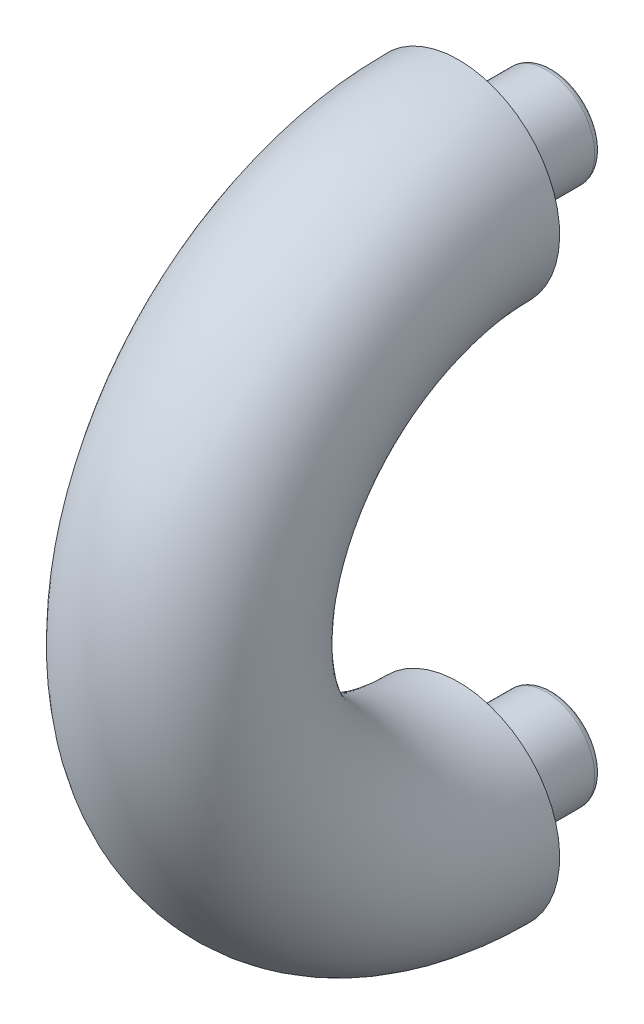
ISO-10303-21;
HEADER;
FILE_DESCRIPTION(('STEP AP214'),'2;1');
FILE_NAME('part.step','',(''),(''),'','','');
FILE_SCHEMA(('AUTOMOTIVE_DESIGN { 1 0 10303 214 1 1 1 1 }'));
ENDSEC;
DATA;
#1=APPLICATION_CONTEXT('core data for automotive mechanical design processes');
#2=APPLICATION_PROTOCOL_DEFINITION('international standard','automotive_design',2000,#1);
#3=PRODUCT_CONTEXT('',#1,'mechanical');
#4=PRODUCT('Part','Part','',(#3));
#5=PRODUCT_RELATED_PRODUCT_CATEGORY('part','',(#4));
#6=PRODUCT_DEFINITION_FORMATION('','',#4);
#7=PRODUCT_DEFINITION_CONTEXT('part definition',#1,'design');
#8=PRODUCT_DEFINITION('design','',#6,#7);
#9=PRODUCT_DEFINITION_SHAPE('','',#8);
#10=(LENGTH_UNIT() NAMED_UNIT(*) SI_UNIT(.MILLI.,.METRE.));
#11=(NAMED_UNIT(*) PLANE_ANGLE_UNIT() SI_UNIT($,.RADIAN.));
#12=(NAMED_UNIT(*) SI_UNIT($,.STERADIAN.) SOLID_ANGLE_UNIT());
#13=UNCERTAINTY_MEASURE_WITH_UNIT(LENGTH_MEASURE(1.E-05),#10,'distance_accuracy_value','');
#14=(GEOMETRIC_REPRESENTATION_CONTEXT(3) GLOBAL_UNCERTAINTY_ASSIGNED_CONTEXT((#13)) GLOBAL_UNIT_ASSIGNED_CONTEXT((#10,
#11,#12)) REPRESENTATION_CONTEXT('',''));
#15=CARTESIAN_POINT('',(0.,0.,0.));
#16=DIRECTION('',(0.,0.,1.));
#17=DIRECTION('',(1.,0.,0.));
#18=AXIS2_PLACEMENT_3D('',#15,#16,#17);
#19=CARTESIAN_POINT('',(0.,0.,0.));
#20=DIRECTION('',(1.,0.,0.));
#21=DIRECTION('',(0.,0.,-1.));
#22=AXIS2_PLACEMENT_3D('',#19,#20,#21);
#23=TOROIDAL_SURFACE('',#22,50.8,19.05);
#24=CARTESIAN_POINT('',(0.,50.8,0.));
#25=DIRECTION('',(0.,0.,-1.));
#26=DIRECTION('',(-1.,0.,0.));
#27=AXIS2_PLACEMENT_3D('',#24,#25,#26);
#28=CIRCLE('',#27,19.05);
#29=CARTESIAN_POINT('',(0.,69.85,0.));
#30=VERTEX_POINT('',#29);
#31=EDGE_CURVE('E96',#30,#30,#28,.F.);
#32=CARTESIAN_POINT('',(0.,-50.8,0.));
#33=DIRECTION('',(0.,0.,-1.));
#34=DIRECTION('',(-1.,0.,0.));
#35=AXIS2_PLACEMENT_3D('',#32,#33,#34);
#36=CIRCLE('',#35,19.05);
#37=CARTESIAN_POINT('',(0.,-69.85,0.));
#38=VERTEX_POINT('',#37);
#39=EDGE_CURVE('E100',#38,#38,#36,.F.);
#40=CARTESIAN_POINT('',(0.,0.,0.));
#41=DIRECTION('',(1.,0.,0.));
#42=DIRECTION('',(0.,0.,-1.));
#43=AXIS2_PLACEMENT_3D('',#40,#41,#42);
#44=CIRCLE('',#43,69.85);
#45=EDGE_CURVE('',#30,#38,#44,.T.);
#46=ORIENTED_EDGE('',*,*,#31,.T.);
#47=ORIENTED_EDGE('',*,*,#39,.T.);
#48=ORIENTED_EDGE('',*,*,#45,.T.);
#49=ORIENTED_EDGE('',*,*,#45,.F.);
#50=EDGE_LOOP('',(#46,#48,#47,#49));
#51=FACE_BOUND('',#50,.T.);
#52=ADVANCED_FACE('F56',(#51),#23,.T.);
#53=CARTESIAN_POINT('',(63.5,83.0144854962469,0.));
#54=DIRECTION('',(0.,0.,-1.));
#55=DIRECTION('',(-1.,0.,0.));
#56=AXIS2_PLACEMENT_3D('',#53,#54,#55);
#57=PLANE('',#56);
#58=CARTESIAN_POINT('',(0.,-50.8,0.));
#59=DIRECTION('',(0.,0.,-1.));
#60=DIRECTION('',(-1.,0.,0.));
#61=AXIS2_PLACEMENT_3D('',#58,#59,#60);
#62=CIRCLE('',#61,10.414);
#63=CARTESIAN_POINT('',(-10.414,-50.8,0.));
#64=VERTEX_POINT('',#63);
#65=EDGE_CURVE('E11',#64,#64,#62,.F.);
#66=ORIENTED_EDGE('',*,*,#65,.T.);
#67=EDGE_LOOP('',(#66));
#68=FACE_BOUND('',#67,.T.);
#69=ORIENTED_EDGE('',*,*,#39,.F.);
#70=EDGE_LOOP('',(#69));
#71=FACE_BOUND('',#70,.T.);
#72=ADVANCED_FACE('F107',(#68,#71),#57,.T.);
#73=CARTESIAN_POINT('',(0.,50.8,0.));
#74=DIRECTION('',(0.,0.,-1.));
#75=DIRECTION('',(-1.,0.,0.));
#76=AXIS2_PLACEMENT_3D('',#73,#74,#75);
#77=CIRCLE('',#76,10.414);
#78=CARTESIAN_POINT('',(-10.414,50.8,0.));
#79=VERTEX_POINT('',#78);
#80=EDGE_CURVE('E69',#79,#79,#77,.F.);
#81=ORIENTED_EDGE('',*,*,#80,.T.);
#82=EDGE_LOOP('',(#81));
#83=FACE_BOUND('',#82,.T.);
#84=ORIENTED_EDGE('',*,*,#31,.F.);
#85=EDGE_LOOP('',(#84));
#86=FACE_BOUND('',#85,.T.);
#87=ADVANCED_FACE('F109',(#83,#86),#57,.T.);
#88=CARTESIAN_POINT('',(0.,50.8,-17.78));
#89=DIRECTION('',(0.,0.,1.));
#90=DIRECTION('',(1.,0.,0.));
#91=AXIS2_PLACEMENT_3D('',#88,#89,#90);
#92=CYLINDRICAL_SURFACE('',#91,9.144);
#93=CARTESIAN_POINT('',(0.,50.8,-1.27));
#94=DIRECTION('',(0.,0.,-1.));
#95=DIRECTION('',(-1.,0.,0.));
#96=AXIS2_PLACEMENT_3D('',#93,#94,#95);
#97=CIRCLE('',#96,9.144);
#98=CARTESIAN_POINT('',(-9.144,50.8,-1.27));
#99=VERTEX_POINT('',#98);
#100=EDGE_CURVE('E74',#99,#99,#97,.T.);
#101=ORIENTED_EDGE('',*,*,#100,.T.);
#102=EDGE_LOOP('',(#101));
#103=FACE_BOUND('',#102,.T.);
#104=CARTESIAN_POINT('',(0.,50.8,-16.51));
#105=DIRECTION('',(0.,0.,-1.));
#106=DIRECTION('',(-1.,0.,0.));
#107=AXIS2_PLACEMENT_3D('',#104,#105,#106);
#108=CIRCLE('',#107,9.144);
#109=CARTESIAN_POINT('',(-9.144,50.8,-16.51));
#110=VERTEX_POINT('',#109);
#111=EDGE_CURVE('E80',#110,#110,#108,.F.);
#112=ORIENTED_EDGE('',*,*,#111,.T.);
#113=EDGE_LOOP('',(#112));
#114=FACE_BOUND('',#113,.T.);
#115=ADVANCED_FACE('F115',(#103,#114),#92,.T.);
#116=CARTESIAN_POINT('',(0.,50.8,-17.78));
#117=DIRECTION('',(0.,0.,-1.));
#118=DIRECTION('',(-1.,0.,0.));
#119=AXIS2_PLACEMENT_3D('',#116,#117,#118);
#120=PLANE('',#119);
#121=CARTESIAN_POINT('',(0.,50.8,-17.78));
#122=DIRECTION('',(0.,0.,-1.));
#123=DIRECTION('',(-1.,0.,0.));
#124=AXIS2_PLACEMENT_3D('',#121,#122,#123);
#125=CIRCLE('',#124,7.874);
#126=CARTESIAN_POINT('',(-7.874,50.8,-17.78));
#127=VERTEX_POINT('',#126);
#128=EDGE_CURVE('E84',#127,#127,#125,.T.);
#129=ORIENTED_EDGE('',*,*,#128,.T.);
#130=EDGE_LOOP('',(#129));
#131=FACE_BOUND('',#130,.T.);
#132=ADVANCED_FACE('F120',(#131),#120,.T.);
#133=CARTESIAN_POINT('',(0.,-50.8,-17.78));
#134=DIRECTION('',(0.,0.,1.));
#135=DIRECTION('',(1.,0.,0.));
#136=AXIS2_PLACEMENT_3D('',#133,#134,#135);
#137=CYLINDRICAL_SURFACE('',#136,9.144);
#138=CARTESIAN_POINT('',(0.,-50.8,-1.27));
#139=DIRECTION('',(0.,0.,-1.));
#140=DIRECTION('',(-1.,0.,0.));
#141=AXIS2_PLACEMENT_3D('',#138,#139,#140);
#142=CIRCLE('',#141,9.144);
#143=CARTESIAN_POINT('',(-9.144,-50.8,-1.27));
#144=VERTEX_POINT('',#143);
#145=EDGE_CURVE('E64',#144,#144,#142,.T.);
#146=ORIENTED_EDGE('',*,*,#145,.T.);
#147=EDGE_LOOP('',(#146));
#148=FACE_BOUND('',#147,.T.);
#149=CARTESIAN_POINT('',(0.,-50.8,-16.51));
#150=DIRECTION('',(0.,0.,-1.));
#151=DIRECTION('',(-1.,0.,0.));
#152=AXIS2_PLACEMENT_3D('',#149,#150,#151);
#153=CIRCLE('',#152,9.144);
#154=CARTESIAN_POINT('',(-9.144,-50.8,-16.51));
#155=VERTEX_POINT('',#154);
#156=EDGE_CURVE('E88',#155,#155,#153,.F.);
#157=ORIENTED_EDGE('',*,*,#156,.T.);
#158=EDGE_LOOP('',(#157));
#159=FACE_BOUND('',#158,.T.);
#160=ADVANCED_FACE('F149',(#148,#159),#137,.T.);
#161=CARTESIAN_POINT('',(0.,-50.8,-17.78));
#162=DIRECTION('',(0.,0.,-1.));
#163=DIRECTION('',(-1.,0.,0.));
#164=AXIS2_PLACEMENT_3D('',#161,#162,#163);
#165=PLANE('',#164);
#166=CARTESIAN_POINT('',(0.,-50.8,-17.78));
#167=DIRECTION('',(0.,0.,-1.));
#168=DIRECTION('',(-1.,0.,0.));
#169=AXIS2_PLACEMENT_3D('',#166,#167,#168);
#170=CIRCLE('',#169,7.874);
#171=CARTESIAN_POINT('',(-7.874,-50.8,-17.78));
#172=VERTEX_POINT('',#171);
#173=EDGE_CURVE('E92',#172,#172,#170,.T.);
#174=ORIENTED_EDGE('',*,*,#173,.T.);
#175=EDGE_LOOP('',(#174));
#176=FACE_BOUND('',#175,.T.);
#177=ADVANCED_FACE('F127',(#176),#165,.T.);
#178=CARTESIAN_POINT('',(0.,-50.8,-16.51));
#179=DIRECTION('',(0.,0.,-1.));
#180=DIRECTION('',(-1.,0.,0.));
#181=AXIS2_PLACEMENT_3D('',#178,#179,#180);
#182=TOROIDAL_SURFACE('',#181,7.874,1.27);
#183=ORIENTED_EDGE('',*,*,#156,.F.);
#184=EDGE_LOOP('',(#183));
#185=FACE_BOUND('',#184,.T.);
#186=ORIENTED_EDGE('',*,*,#173,.F.);
#187=EDGE_LOOP('',(#186));
#188=FACE_BOUND('',#187,.T.);
#189=ADVANCED_FACE('F123',(#185,#188),#182,.T.);
#190=CARTESIAN_POINT('',(0.,50.8,-16.51));
#191=DIRECTION('',(0.,0.,-1.));
#192=DIRECTION('',(-1.,0.,0.));
#193=AXIS2_PLACEMENT_3D('',#190,#191,#192);
#194=TOROIDAL_SURFACE('',#193,7.874,1.27);
#195=ORIENTED_EDGE('',*,*,#111,.F.);
#196=EDGE_LOOP('',(#195));
#197=FACE_BOUND('',#196,.T.);
#198=ORIENTED_EDGE('',*,*,#128,.F.);
#199=EDGE_LOOP('',(#198));
#200=FACE_BOUND('',#199,.T.);
#201=ADVANCED_FACE('F126',(#197,#200),#194,.T.);
#202=CARTESIAN_POINT('',(0.,50.8,-1.27));
#203=DIRECTION('',(0.,0.,-1.));
#204=DIRECTION('',(-1.,0.,0.));
#205=AXIS2_PLACEMENT_3D('',#202,#203,#204);
#206=TOROIDAL_SURFACE('',#205,10.414,1.27);
#207=ORIENTED_EDGE('',*,*,#80,.F.);
#208=EDGE_LOOP('',(#207));
#209=FACE_BOUND('',#208,.T.);
#210=ORIENTED_EDGE('',*,*,#100,.F.);
#211=EDGE_LOOP('',(#210));
#212=FACE_BOUND('',#211,.T.);
#213=ADVANCED_FACE('F129',(#209,#212),#206,.F.);
#214=CARTESIAN_POINT('',(0.,-50.8,-1.27));
#215=DIRECTION('',(0.,0.,-1.));
#216=DIRECTION('',(-1.,0.,0.));
#217=AXIS2_PLACEMENT_3D('',#214,#215,#216);
#218=TOROIDAL_SURFACE('',#217,10.414,1.27);
#219=ORIENTED_EDGE('',*,*,#65,.F.);
#220=EDGE_LOOP('',(#219));
#221=FACE_BOUND('',#220,.T.);
#222=ORIENTED_EDGE('',*,*,#145,.F.);
#223=EDGE_LOOP('',(#222));
#224=FACE_BOUND('',#223,.T.);
#225=ADVANCED_FACE('F58',(#221,#224),#218,.F.);
#226=CLOSED_SHELL('',(#52,#72,#87,#115,#132,#160,#177,#189,#201,#213,#225));
#227=MANIFOLD_SOLID_BREP('B2',#226);
#228=ADVANCED_BREP_SHAPE_REPRESENTATION('',(#18,#227),#14);
#229=SHAPE_DEFINITION_REPRESENTATION(#9,#228);
ENDSEC;
END-ISO-10303-21;
